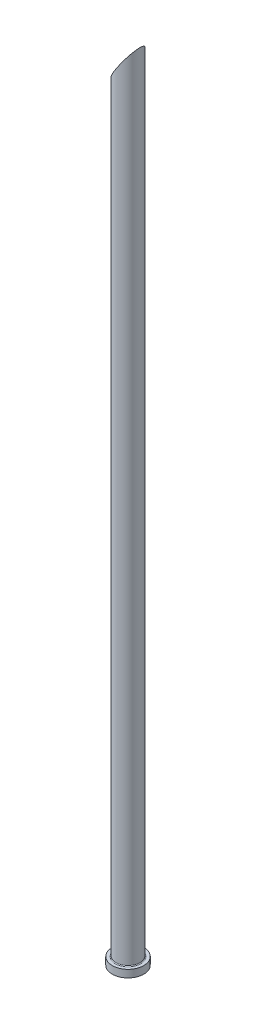
ISO-10303-21;
HEADER;
FILE_DESCRIPTION(('STEP AP214'),'2;1');
FILE_NAME('part.step','',(''),(''),'','','');
FILE_SCHEMA(('AUTOMOTIVE_DESIGN { 1 0 10303 214 1 1 1 1 }'));
ENDSEC;
DATA;
#1=APPLICATION_CONTEXT('core data for automotive mechanical design processes');
#2=APPLICATION_PROTOCOL_DEFINITION('international standard','automotive_design',2000,#1);
#3=PRODUCT_CONTEXT('',#1,'mechanical');
#4=PRODUCT('Part','Part','',(#3));
#5=PRODUCT_RELATED_PRODUCT_CATEGORY('part','',(#4));
#6=PRODUCT_DEFINITION_FORMATION('','',#4);
#7=PRODUCT_DEFINITION_CONTEXT('part definition',#1,'design');
#8=PRODUCT_DEFINITION('design','',#6,#7);
#9=PRODUCT_DEFINITION_SHAPE('','',#8);
#10=(LENGTH_UNIT() NAMED_UNIT(*) SI_UNIT(.MILLI.,.METRE.));
#11=(NAMED_UNIT(*) PLANE_ANGLE_UNIT() SI_UNIT($,.RADIAN.));
#12=(NAMED_UNIT(*) SI_UNIT($,.STERADIAN.) SOLID_ANGLE_UNIT());
#13=UNCERTAINTY_MEASURE_WITH_UNIT(LENGTH_MEASURE(1.E-05),#10,'distance_accuracy_value','');
#14=(GEOMETRIC_REPRESENTATION_CONTEXT(3) GLOBAL_UNCERTAINTY_ASSIGNED_CONTEXT((#13)) GLOBAL_UNIT_ASSIGNED_CONTEXT((#10,
#11,#12)) REPRESENTATION_CONTEXT('',''));
#15=CARTESIAN_POINT('',(0.,0.,0.));
#16=DIRECTION('',(0.,0.,1.));
#17=DIRECTION('',(1.,0.,0.));
#18=AXIS2_PLACEMENT_3D('',#15,#16,#17);
#19=CARTESIAN_POINT('',(0.,30.8690980323831,0.));
#20=DIRECTION('',(0.,-1.,0.));
#21=DIRECTION('',(0.,0.,-1.));
#22=AXIS2_PLACEMENT_3D('',#19,#20,#21);
#23=CYLINDRICAL_SURFACE('',#22,0.2794);
#24=CARTESIAN_POINT('',(0.,54.6576342347385,0.));
#25=DIRECTION('',(-0.837863058280952,0.545880477364863,0.));
#26=DIRECTION('',(-0.545880477364863,-0.837863058280952,0.));
#27=AXIS2_PLACEMENT_3D('',#24,#25,#26);
#28=ELLIPSE('',#27,0.511833655141418,0.2794);
#29=CARTESIAN_POINT('',(-0.2794,54.2287877231106,0.));
#30=VERTEX_POINT('',#29);
#31=EDGE_CURVE('E48',#30,#30,#28,.F.);
#32=ORIENTED_EDGE('',*,*,#31,.F.);
#33=EDGE_LOOP('',(#32));
#34=FACE_BOUND('',#33,.T.);
#35=CARTESIAN_POINT('',(0.,28.1585421431135,0.));
#36=DIRECTION('',(0.,-1.,0.));
#37=DIRECTION('',(0.,0.,-1.));
#38=AXIS2_PLACEMENT_3D('',#35,#36,#37);
#39=CIRCLE('',#38,0.2794);
#40=CARTESIAN_POINT('',(0.,28.1585421431135,-0.2794));
#41=VERTEX_POINT('',#40);
#42=EDGE_CURVE('E61',#41,#41,#39,.T.);
#43=ORIENTED_EDGE('',*,*,#42,.T.);
#44=EDGE_LOOP('',(#43));
#45=FACE_BOUND('',#44,.T.);
#46=ADVANCED_FACE('F37',(#34,#45),#23,.F.);
#47=CARTESIAN_POINT('',(0.,30.8690980323831,0.));
#48=DIRECTION('',(0.,-1.,0.));
#49=DIRECTION('',(0.,0.,-1.));
#50=AXIS2_PLACEMENT_3D('',#47,#48,#49);
#51=CYLINDRICAL_SURFACE('',#50,0.4064);
#52=CARTESIAN_POINT('',(0.,28.4379421431135,0.));
#53=DIRECTION('',(0.,-1.,0.));
#54=DIRECTION('',(0.,0.,-1.));
#55=AXIS2_PLACEMENT_3D('',#52,#53,#54);
#56=CIRCLE('',#55,0.4064);
#57=CARTESIAN_POINT('',(0.,28.4379421431135,-0.4064));
#58=VERTEX_POINT('',#57);
#59=EDGE_CURVE('E10',#58,#58,#56,.F.);
#60=ORIENTED_EDGE('',*,*,#59,.T.);
#61=EDGE_LOOP('',(#60));
#62=FACE_BOUND('',#61,.T.);
#63=CARTESIAN_POINT('',(0.,54.6576342347385,0.));
#64=DIRECTION('',(-0.837863058280952,0.545880477364863,0.));
#65=DIRECTION('',(-0.545880477364863,-0.837863058280952,0.));
#66=AXIS2_PLACEMENT_3D('',#63,#64,#65);
#67=ELLIPSE('',#66,0.744485316569335,0.4064);
#68=CARTESIAN_POINT('',(-0.4064,54.0338574905524,0.));
#69=VERTEX_POINT('',#68);
#70=EDGE_CURVE('E52',#69,#69,#67,.F.);
#71=ORIENTED_EDGE('',*,*,#70,.T.);
#72=EDGE_LOOP('',(#71));
#73=FACE_BOUND('',#72,.T.);
#74=ADVANCED_FACE('F80',(#62,#73),#51,.T.);
#75=CARTESIAN_POINT('',(-2.91148494305858,50.1888433919044,34.2239120591283));
#76=DIRECTION('',(-0.837863058280952,0.545880477364863,0.));
#77=DIRECTION('',(-0.545880477364863,-0.837863058280952,0.));
#78=AXIS2_PLACEMENT_3D('',#75,#76,#77);
#79=PLANE('',#78);
#80=ORIENTED_EDGE('',*,*,#70,.F.);
#81=EDGE_LOOP('',(#80));
#82=FACE_BOUND('',#81,.T.);
#83=ORIENTED_EDGE('',*,*,#31,.T.);
#84=EDGE_LOOP('',(#83));
#85=FACE_BOUND('',#84,.T.);
#86=ADVANCED_FACE('F71',(#82,#85),#79,.T.);
#87=CARTESIAN_POINT('',(0.,28.1585421431135,0.));
#88=DIRECTION('',(0.,-1.,0.));
#89=DIRECTION('',(0.,0.,-1.));
#90=AXIS2_PLACEMENT_3D('',#87,#88,#89);
#91=PLANE('',#90);
#92=CARTESIAN_POINT('',(0.,28.1585421431135,0.));
#93=DIRECTION('',(0.,-1.,0.));
#94=DIRECTION('',(0.,0.,-1.));
#95=AXIS2_PLACEMENT_3D('',#92,#93,#94);
#96=CIRCLE('',#95,0.5334);
#97=CARTESIAN_POINT('',(0.,28.1585421431135,-0.5334));
#98=VERTEX_POINT('',#97);
#99=EDGE_CURVE('E56',#98,#98,#96,.T.);
#100=ORIENTED_EDGE('',*,*,#99,.T.);
#101=EDGE_LOOP('',(#100));
#102=FACE_BOUND('',#101,.T.);
#103=ORIENTED_EDGE('',*,*,#42,.F.);
#104=EDGE_LOOP('',(#103));
#105=FACE_BOUND('',#104,.T.);
#106=ADVANCED_FACE('F68',(#102,#105),#91,.T.);
#107=CARTESIAN_POINT('',(0.,28.4125421431135,0.));
#108=DIRECTION('',(0.,-1.,0.));
#109=DIRECTION('',(0.,0.,-1.));
#110=AXIS2_PLACEMENT_3D('',#107,#108,#109);
#111=PLANE('',#110);
#112=CARTESIAN_POINT('',(0.,28.4125421431135,0.));
#113=DIRECTION('',(0.,-1.,0.));
#114=DIRECTION('',(0.,0.,-1.));
#115=AXIS2_PLACEMENT_3D('',#112,#113,#114);
#116=CIRCLE('',#115,0.4318);
#117=CARTESIAN_POINT('',(0.,28.4125421431135,-0.4318));
#118=VERTEX_POINT('',#117);
#119=EDGE_CURVE('E44',#118,#118,#116,.T.);
#120=ORIENTED_EDGE('',*,*,#119,.T.);
#121=EDGE_LOOP('',(#120));
#122=FACE_BOUND('',#121,.T.);
#123=CARTESIAN_POINT('',(0.,28.4125421431135,0.));
#124=DIRECTION('',(0.,-1.,0.));
#125=DIRECTION('',(0.,0.,-1.));
#126=AXIS2_PLACEMENT_3D('',#123,#124,#125);
#127=CIRCLE('',#126,0.5334);
#128=CARTESIAN_POINT('',(0.,28.4125421431135,-0.5334));
#129=VERTEX_POINT('',#128);
#130=EDGE_CURVE('E58',#129,#129,#127,.T.);
#131=ORIENTED_EDGE('',*,*,#130,.F.);
#132=EDGE_LOOP('',(#131));
#133=FACE_BOUND('',#132,.T.);
#134=ADVANCED_FACE('F70',(#122,#133),#111,.F.);
#135=CARTESIAN_POINT('',(0.,28.1585421431135,0.));
#136=DIRECTION('',(0.,1.,0.));
#137=DIRECTION('',(0.,0.,1.));
#138=AXIS2_PLACEMENT_3D('',#135,#136,#137);
#139=CYLINDRICAL_SURFACE('',#138,0.5334);
#140=ORIENTED_EDGE('',*,*,#99,.F.);
#141=EDGE_LOOP('',(#140));
#142=FACE_BOUND('',#141,.T.);
#143=ORIENTED_EDGE('',*,*,#130,.T.);
#144=EDGE_LOOP('',(#143));
#145=FACE_BOUND('',#144,.T.);
#146=ADVANCED_FACE('F78',(#142,#145),#139,.T.);
#147=CARTESIAN_POINT('',(0.,28.4379421431135,0.));
#148=DIRECTION('',(0.,-1.,0.));
#149=DIRECTION('',(0.,0.,-1.));
#150=AXIS2_PLACEMENT_3D('',#147,#148,#149);
#151=TOROIDAL_SURFACE('',#150,0.4318,0.0254);
#152=ORIENTED_EDGE('',*,*,#59,.F.);
#153=EDGE_LOOP('',(#152));
#154=FACE_BOUND('',#153,.T.);
#155=ORIENTED_EDGE('',*,*,#119,.F.);
#156=EDGE_LOOP('',(#155));
#157=FACE_BOUND('',#156,.T.);
#158=ADVANCED_FACE('F39',(#154,#157),#151,.F.);
#159=CLOSED_SHELL('',(#46,#74,#86,#106,#134,#146,#158));
#160=MANIFOLD_SOLID_BREP('B2',#159);
#161=ADVANCED_BREP_SHAPE_REPRESENTATION('',(#18,#160),#14);
#162=SHAPE_DEFINITION_REPRESENTATION(#9,#161);
ENDSEC;
END-ISO-10303-21;
